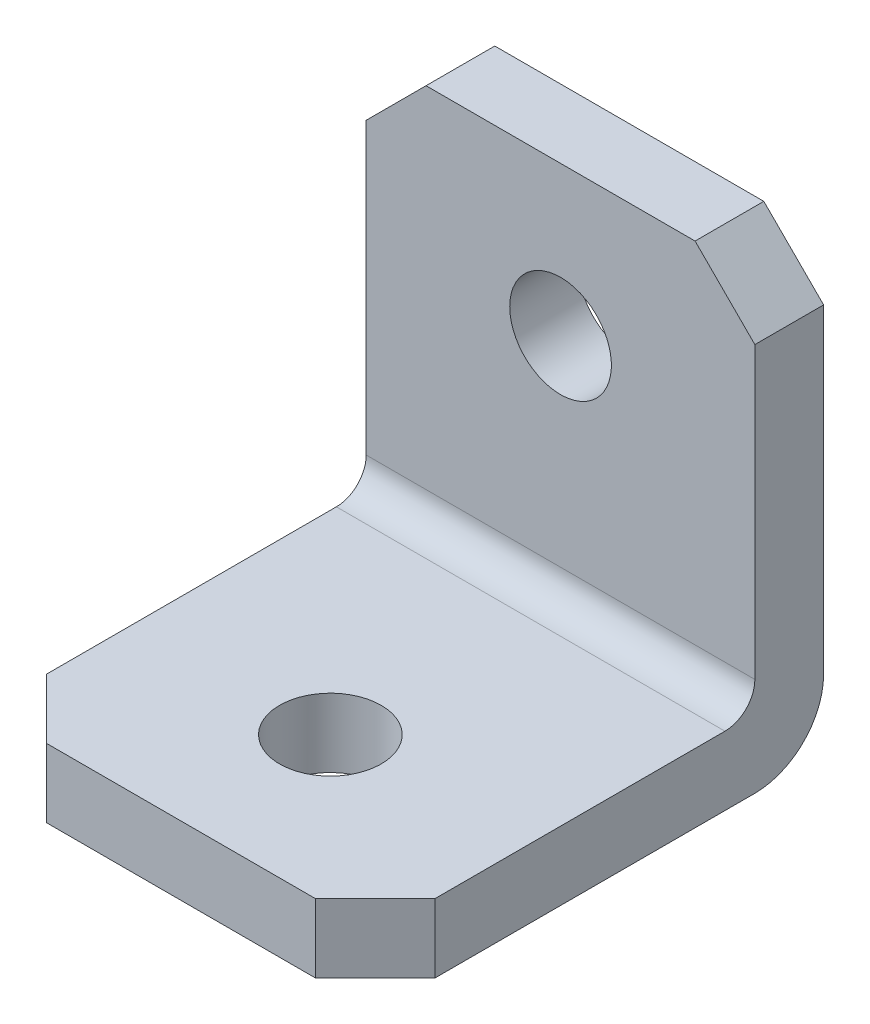
ISO-10303-21;
HEADER;
FILE_DESCRIPTION(('STEP AP214'),'2;1');
FILE_NAME('part.step','',(''),(''),'','','');
FILE_SCHEMA(('AUTOMOTIVE_DESIGN { 1 0 10303 214 1 1 1 1 }'));
ENDSEC;
DATA;
#1=APPLICATION_CONTEXT('core data for automotive mechanical design processes');
#2=APPLICATION_PROTOCOL_DEFINITION('international standard','automotive_design',2000,#1);
#3=PRODUCT_CONTEXT('',#1,'mechanical');
#4=PRODUCT('Part','Part','',(#3));
#5=PRODUCT_RELATED_PRODUCT_CATEGORY('part','',(#4));
#6=PRODUCT_DEFINITION_FORMATION('','',#4);
#7=PRODUCT_DEFINITION_CONTEXT('part definition',#1,'design');
#8=PRODUCT_DEFINITION('design','',#6,#7);
#9=PRODUCT_DEFINITION_SHAPE('','',#8);
#10=(LENGTH_UNIT() NAMED_UNIT(*) SI_UNIT(.MILLI.,.METRE.));
#11=(NAMED_UNIT(*) PLANE_ANGLE_UNIT() SI_UNIT($,.RADIAN.));
#12=(NAMED_UNIT(*) SI_UNIT($,.STERADIAN.) SOLID_ANGLE_UNIT());
#13=UNCERTAINTY_MEASURE_WITH_UNIT(LENGTH_MEASURE(1.E-05),#10,'distance_accuracy_value','');
#14=(GEOMETRIC_REPRESENTATION_CONTEXT(3) GLOBAL_UNCERTAINTY_ASSIGNED_CONTEXT((#13)) GLOBAL_UNIT_ASSIGNED_CONTEXT((#10,
#11,#12)) REPRESENTATION_CONTEXT('',''));
#15=CARTESIAN_POINT('',(0.,0.,0.));
#16=DIRECTION('',(0.,0.,1.));
#17=DIRECTION('',(1.,0.,0.));
#18=AXIS2_PLACEMENT_3D('',#15,#16,#17);
#19=CARTESIAN_POINT('',(6.5,2.3,3.3));
#20=DIRECTION('',(0.,-1.,0.));
#21=DIRECTION('',(0.,0.,-1.));
#22=AXIS2_PLACEMENT_3D('',#19,#20,#21);
#23=PLANE('',#22);
#24=CARTESIAN_POINT('',(0.,2.3,10.));
#25=DIRECTION('',(0.,1.,0.));
#26=DIRECTION('',(0.,0.,-1.));
#27=AXIS2_PLACEMENT_3D('',#24,#25,#26);
#28=CIRCLE('',#27,1.7);
#29=CARTESIAN_POINT('',(0.,2.3,8.3));
#30=VERTEX_POINT('',#29);
#31=EDGE_CURVE('E127',#30,#30,#28,.T.);
#32=ORIENTED_EDGE('',*,*,#31,.F.);
#33=EDGE_LOOP('',(#32));
#34=FACE_BOUND('',#33,.T.);
#35=DIRECTION('',(-1.,0.,0.));
#36=VECTOR('',#35,1.);
#37=CARTESIAN_POINT('',(4.5,2.3,15.));
#38=LINE('',#37,#36);
#39=CARTESIAN_POINT('',(4.5,2.3,15.));
#40=VERTEX_POINT('',#39);
#41=CARTESIAN_POINT('',(-4.5,2.3,15.));
#42=VERTEX_POINT('',#41);
#43=EDGE_CURVE('E114',#40,#42,#38,.T.);
#44=ORIENTED_EDGE('',*,*,#43,.F.);
#45=DIRECTION('',(0.707106781186548,0.,-0.707106781186547));
#46=VECTOR('',#45,1.);
#47=CARTESIAN_POINT('',(4.49999999999999,2.3,15.));
#48=LINE('',#47,#46);
#49=CARTESIAN_POINT('',(6.5,2.3,13.));
#50=VERTEX_POINT('',#49);
#51=EDGE_CURVE('E103',#40,#50,#48,.T.);
#52=ORIENTED_EDGE('',*,*,#51,.T.);
#53=DIRECTION('',(0.,0.,1.));
#54=VECTOR('',#53,1.);
#55=CARTESIAN_POINT('',(6.5,2.3,3.3));
#56=LINE('',#55,#54);
#57=CARTESIAN_POINT('',(6.5,2.3,3.3));
#58=VERTEX_POINT('',#57);
#59=EDGE_CURVE('E113',#58,#50,#56,.T.);
#60=ORIENTED_EDGE('',*,*,#59,.F.);
#61=DIRECTION('',(-1.,0.,0.));
#62=VECTOR('',#61,1.);
#63=CARTESIAN_POINT('',(6.5,2.3,3.3));
#64=LINE('',#63,#62);
#65=CARTESIAN_POINT('',(-6.5,2.3,3.3));
#66=VERTEX_POINT('',#65);
#67=EDGE_CURVE('E137',#58,#66,#64,.T.);
#68=ORIENTED_EDGE('',*,*,#67,.T.);
#69=DIRECTION('',(0.,0.,1.));
#70=VECTOR('',#69,1.);
#71=CARTESIAN_POINT('',(-6.5,2.3,3.3));
#72=LINE('',#71,#70);
#73=CARTESIAN_POINT('',(-6.5,2.3,13.));
#74=VERTEX_POINT('',#73);
#75=EDGE_CURVE('E142',#66,#74,#72,.T.);
#76=ORIENTED_EDGE('',*,*,#75,.T.);
#77=DIRECTION('',(0.707106781186548,0.,0.707106781186547));
#78=VECTOR('',#77,1.);
#79=CARTESIAN_POINT('',(-6.5,2.3,13.));
#80=LINE('',#79,#78);
#81=EDGE_CURVE('E126',#74,#42,#80,.T.);
#82=ORIENTED_EDGE('',*,*,#81,.T.);
#83=EDGE_LOOP('',(#44,#52,#60,#68,#76,#82));
#84=FACE_BOUND('',#83,.T.);
#85=ADVANCED_FACE('F16',(#34,#84),#23,.F.);
#86=CARTESIAN_POINT('',(0.,3.,10.));
#87=DIRECTION('',(0.,-1.,0.));
#88=DIRECTION('',(0.,0.,-1.));
#89=AXIS2_PLACEMENT_3D('',#86,#87,#88);
#90=CYLINDRICAL_SURFACE('',#89,1.7);
#91=CARTESIAN_POINT('',(0.,0.,10.));
#92=DIRECTION('',(0.,1.,0.));
#93=DIRECTION('',(1.,0.,0.));
#94=AXIS2_PLACEMENT_3D('',#91,#92,#93);
#95=CIRCLE('',#94,1.7);
#96=CARTESIAN_POINT('',(1.7,0.,10.));
#97=VERTEX_POINT('',#96);
#98=EDGE_CURVE('E149',#97,#97,#95,.T.);
#99=ORIENTED_EDGE('',*,*,#98,.F.);
#100=EDGE_LOOP('',(#99));
#101=FACE_BOUND('',#100,.T.);
#102=ORIENTED_EDGE('',*,*,#31,.T.);
#103=EDGE_LOOP('',(#102));
#104=FACE_BOUND('',#103,.T.);
#105=ADVANCED_FACE('F323',(#101,#104),#90,.F.);
#106=CARTESIAN_POINT('',(6.5,2.3,15.));
#107=DIRECTION('',(0.,0.,-1.));
#108=DIRECTION('',(-1.,0.,0.));
#109=AXIS2_PLACEMENT_3D('',#106,#107,#108);
#110=PLANE('',#109);
#111=DIRECTION('',(-1.,0.,0.));
#112=VECTOR('',#111,1.);
#113=CARTESIAN_POINT('',(4.5,0.,15.));
#114=LINE('',#113,#112);
#115=CARTESIAN_POINT('',(4.5,0.,15.));
#116=VERTEX_POINT('',#115);
#117=CARTESIAN_POINT('',(-4.5,0.,15.));
#118=VERTEX_POINT('',#117);
#119=EDGE_CURVE('E121',#116,#118,#114,.T.);
#120=ORIENTED_EDGE('',*,*,#119,.F.);
#121=DIRECTION('',(0.,-1.,0.));
#122=VECTOR('',#121,1.);
#123=CARTESIAN_POINT('',(4.5,2.3,15.));
#124=LINE('',#123,#122);
#125=EDGE_CURVE('E107',#40,#116,#124,.T.);
#126=ORIENTED_EDGE('',*,*,#125,.F.);
#127=ORIENTED_EDGE('',*,*,#43,.T.);
#128=DIRECTION('',(0.,-1.,0.));
#129=VECTOR('',#128,1.);
#130=CARTESIAN_POINT('',(-4.5,2.3,15.));
#131=LINE('',#130,#129);
#132=EDGE_CURVE('E122',#42,#118,#131,.T.);
#133=ORIENTED_EDGE('',*,*,#132,.T.);
#134=EDGE_LOOP('',(#120,#126,#127,#133));
#135=FACE_BOUND('',#134,.T.);
#136=ADVANCED_FACE('F119',(#135),#110,.F.);
#137=CARTESIAN_POINT('',(4.5,3.,15.));
#138=DIRECTION('',(-0.707106781186547,0.,-0.707106781186548));
#139=DIRECTION('',(-0.707106781186548,0.,0.707106781186547));
#140=AXIS2_PLACEMENT_3D('',#137,#138,#139);
#141=PLANE('',#140);
#142=ORIENTED_EDGE('',*,*,#125,.T.);
#143=DIRECTION('',(0.707106781186548,0.,-0.707106781186547));
#144=VECTOR('',#143,1.);
#145=CARTESIAN_POINT('',(4.5,0.,15.));
#146=LINE('',#145,#144);
#147=CARTESIAN_POINT('',(6.5,0.,13.));
#148=VERTEX_POINT('',#147);
#149=EDGE_CURVE('E160',#116,#148,#146,.T.);
#150=ORIENTED_EDGE('',*,*,#149,.T.);
#151=DIRECTION('',(0.,1.,0.));
#152=VECTOR('',#151,1.);
#153=CARTESIAN_POINT('',(6.5,0.,13.));
#154=LINE('',#153,#152);
#155=EDGE_CURVE('E109',#148,#50,#154,.T.);
#156=ORIENTED_EDGE('',*,*,#155,.T.);
#157=ORIENTED_EDGE('',*,*,#51,.F.);
#158=EDGE_LOOP('',(#142,#150,#156,#157));
#159=FACE_BOUND('',#158,.T.);
#160=ADVANCED_FACE('F105',(#159),#141,.F.);
#161=CARTESIAN_POINT('',(6.5,2.3,2.3));
#162=DIRECTION('',(1.,0.,0.));
#163=DIRECTION('',(0.,0.,-1.));
#164=AXIS2_PLACEMENT_3D('',#161,#162,#163);
#165=PLANE('',#164);
#166=DIRECTION('',(0.,-1.,0.));
#167=VECTOR('',#166,1.);
#168=CARTESIAN_POINT('',(6.5,13.,2.3));
#169=LINE('',#168,#167);
#170=CARTESIAN_POINT('',(6.5,13.,2.3));
#171=VERTEX_POINT('',#170);
#172=CARTESIAN_POINT('',(6.5,3.3,2.3));
#173=VERTEX_POINT('',#172);
#174=EDGE_CURVE('E167',#171,#173,#169,.T.);
#175=ORIENTED_EDGE('',*,*,#174,.T.);
#176=CARTESIAN_POINT('',(6.5,3.30000000000017,3.30000000000017));
#177=DIRECTION('',(1.,0.,0.));
#178=DIRECTION('',(0.,-1.,-1.65201186064197E-13));
#179=AXIS2_PLACEMENT_3D('',#176,#177,#178);
#180=CIRCLE('',#179,1.00000000000016);
#181=EDGE_CURVE('E172',#58,#173,#180,.T.);
#182=ORIENTED_EDGE('',*,*,#181,.F.);
#183=ORIENTED_EDGE('',*,*,#59,.T.);
#184=ORIENTED_EDGE('',*,*,#155,.F.);
#185=DIRECTION('',(0.,0.,-1.));
#186=VECTOR('',#185,1.);
#187=CARTESIAN_POINT('',(6.5,0.,13.));
#188=LINE('',#187,#186);
#189=CARTESIAN_POINT('',(6.5,0.,2.3));
#190=VERTEX_POINT('',#189);
#191=EDGE_CURVE('E177',#148,#190,#188,.T.);
#192=ORIENTED_EDGE('',*,*,#191,.T.);
#193=CARTESIAN_POINT('',(6.5,2.3,2.3));
#194=DIRECTION('',(1.,0.,0.));
#195=DIRECTION('',(0.,-1.,0.));
#196=AXIS2_PLACEMENT_3D('',#193,#194,#195);
#197=CIRCLE('',#196,2.3);
#198=CARTESIAN_POINT('',(6.5,2.3,0.));
#199=VERTEX_POINT('',#198);
#200=EDGE_CURVE('E182',#190,#199,#197,.T.);
#201=ORIENTED_EDGE('',*,*,#200,.T.);
#202=DIRECTION('',(0.,1.,0.));
#203=VECTOR('',#202,1.);
#204=CARTESIAN_POINT('',(6.5,2.3,0.));
#205=LINE('',#204,#203);
#206=CARTESIAN_POINT('',(6.5,13.,0.));
#207=VERTEX_POINT('',#206);
#208=EDGE_CURVE('E187',#199,#207,#205,.T.);
#209=ORIENTED_EDGE('',*,*,#208,.T.);
#210=DIRECTION('',(0.,0.,-1.));
#211=VECTOR('',#210,1.);
#212=CARTESIAN_POINT('',(6.5,13.,2.3));
#213=LINE('',#212,#211);
#214=EDGE_CURVE('E192',#171,#207,#213,.T.);
#215=ORIENTED_EDGE('',*,*,#214,.F.);
#216=EDGE_LOOP('',(#175,#182,#183,#184,#192,#201,#209,#215));
#217=FACE_BOUND('',#216,.T.);
#218=ADVANCED_FACE('F302',(#217),#165,.T.);
#219=CARTESIAN_POINT('',(6.5,3.30000000000017,3.30000000000017));
#220=DIRECTION('',(-1.,0.,0.));
#221=DIRECTION('',(0.,0.,1.));
#222=AXIS2_PLACEMENT_3D('',#219,#220,#221);
#223=CYLINDRICAL_SURFACE('',#222,1.00000000000016);
#224=CARTESIAN_POINT('',(-6.5,3.30000000000017,3.30000000000017));
#225=DIRECTION('',(1.,0.,0.));
#226=DIRECTION('',(0.,-1.,-1.65201186064197E-13));
#227=AXIS2_PLACEMENT_3D('',#224,#225,#226);
#228=CIRCLE('',#227,1.00000000000016);
#229=CARTESIAN_POINT('',(-6.5,3.3,2.3));
#230=VERTEX_POINT('',#229);
#231=EDGE_CURVE('E196',#66,#230,#228,.T.);
#232=ORIENTED_EDGE('',*,*,#231,.F.);
#233=ORIENTED_EDGE('',*,*,#67,.F.);
#234=ORIENTED_EDGE('',*,*,#181,.T.);
#235=DIRECTION('',(-1.,0.,0.));
#236=VECTOR('',#235,1.);
#237=CARTESIAN_POINT('',(6.5,3.3,2.3));
#238=LINE('',#237,#236);
#239=EDGE_CURVE('E201',#173,#230,#238,.T.);
#240=ORIENTED_EDGE('',*,*,#239,.T.);
#241=EDGE_LOOP('',(#232,#233,#234,#240));
#242=FACE_BOUND('',#241,.T.);
#243=ADVANCED_FACE('F320',(#242),#223,.F.);
#244=CARTESIAN_POINT('',(-6.5,2.3,2.3));
#245=DIRECTION('',(1.,0.,0.));
#246=DIRECTION('',(0.,0.,-1.));
#247=AXIS2_PLACEMENT_3D('',#244,#245,#246);
#248=PLANE('',#247);
#249=DIRECTION('',(0.,0.,-1.));
#250=VECTOR('',#249,1.);
#251=CARTESIAN_POINT('',(-6.5,13.,2.3));
#252=LINE('',#251,#250);
#253=CARTESIAN_POINT('',(-6.5,13.,2.3));
#254=VERTEX_POINT('',#253);
#255=CARTESIAN_POINT('',(-6.5,13.,0.));
#256=VERTEX_POINT('',#255);
#257=EDGE_CURVE('E206',#254,#256,#252,.T.);
#258=ORIENTED_EDGE('',*,*,#257,.T.);
#259=DIRECTION('',(0.,1.,0.));
#260=VECTOR('',#259,1.);
#261=CARTESIAN_POINT('',(-6.5,2.3,0.));
#262=LINE('',#261,#260);
#263=CARTESIAN_POINT('',(-6.5,2.3,0.));
#264=VERTEX_POINT('',#263);
#265=EDGE_CURVE('E211',#264,#256,#262,.T.);
#266=ORIENTED_EDGE('',*,*,#265,.F.);
#267=CARTESIAN_POINT('',(-6.5,2.3,2.3));
#268=DIRECTION('',(1.,0.,0.));
#269=DIRECTION('',(0.,-1.,0.));
#270=AXIS2_PLACEMENT_3D('',#267,#268,#269);
#271=CIRCLE('',#270,2.3);
#272=CARTESIAN_POINT('',(-6.5,0.,2.3));
#273=VERTEX_POINT('',#272);
#274=EDGE_CURVE('E216',#273,#264,#271,.T.);
#275=ORIENTED_EDGE('',*,*,#274,.F.);
#276=DIRECTION('',(0.,0.,-1.));
#277=VECTOR('',#276,1.);
#278=CARTESIAN_POINT('',(-6.5,0.,13.));
#279=LINE('',#278,#277);
#280=CARTESIAN_POINT('',(-6.5,0.,13.));
#281=VERTEX_POINT('',#280);
#282=EDGE_CURVE('E221',#281,#273,#279,.T.);
#283=ORIENTED_EDGE('',*,*,#282,.F.);
#284=DIRECTION('',(0.,1.,0.));
#285=VECTOR('',#284,1.);
#286=CARTESIAN_POINT('',(-6.5,0.,13.));
#287=LINE('',#286,#285);
#288=EDGE_CURVE('E226',#281,#74,#287,.T.);
#289=ORIENTED_EDGE('',*,*,#288,.T.);
#290=ORIENTED_EDGE('',*,*,#75,.F.);
#291=ORIENTED_EDGE('',*,*,#231,.T.);
#292=DIRECTION('',(0.,-1.,0.));
#293=VECTOR('',#292,1.);
#294=CARTESIAN_POINT('',(-6.5,13.,2.3));
#295=LINE('',#294,#293);
#296=EDGE_CURVE('E231',#254,#230,#295,.T.);
#297=ORIENTED_EDGE('',*,*,#296,.F.);
#298=EDGE_LOOP('',(#258,#266,#275,#283,#289,#290,#291,#297));
#299=FACE_BOUND('',#298,.T.);
#300=ADVANCED_FACE('F293',(#299),#248,.F.);
#301=CARTESIAN_POINT('',(-6.5,3.,13.));
#302=DIRECTION('',(0.707106781186547,0.,-0.707106781186548));
#303=DIRECTION('',(-0.707106781186548,0.,-0.707106781186547));
#304=AXIS2_PLACEMENT_3D('',#301,#302,#303);
#305=PLANE('',#304);
#306=ORIENTED_EDGE('',*,*,#288,.F.);
#307=DIRECTION('',(0.707106781186548,0.,0.707106781186547));
#308=VECTOR('',#307,1.);
#309=CARTESIAN_POINT('',(-6.5,0.,13.));
#310=LINE('',#309,#308);
#311=EDGE_CURVE('E235',#281,#118,#310,.T.);
#312=ORIENTED_EDGE('',*,*,#311,.T.);
#313=ORIENTED_EDGE('',*,*,#132,.F.);
#314=ORIENTED_EDGE('',*,*,#81,.F.);
#315=EDGE_LOOP('',(#306,#312,#313,#314));
#316=FACE_BOUND('',#315,.T.);
#317=ADVANCED_FACE('F309',(#316),#305,.F.);
#318=CARTESIAN_POINT('',(6.5,0.,15.));
#319=DIRECTION('',(0.,1.,0.));
#320=DIRECTION('',(0.,0.,1.));
#321=AXIS2_PLACEMENT_3D('',#318,#319,#320);
#322=PLANE('',#321);
#323=ORIENTED_EDGE('',*,*,#98,.T.);
#324=EDGE_LOOP('',(#323));
#325=FACE_BOUND('',#324,.T.);
#326=ORIENTED_EDGE('',*,*,#191,.F.);
#327=ORIENTED_EDGE('',*,*,#149,.F.);
#328=ORIENTED_EDGE('',*,*,#119,.T.);
#329=ORIENTED_EDGE('',*,*,#311,.F.);
#330=ORIENTED_EDGE('',*,*,#282,.T.);
#331=DIRECTION('',(-1.,0.,0.));
#332=VECTOR('',#331,1.);
#333=CARTESIAN_POINT('',(6.5,0.,2.3));
#334=LINE('',#333,#332);
#335=EDGE_CURVE('E240',#190,#273,#334,.T.);
#336=ORIENTED_EDGE('',*,*,#335,.F.);
#337=EDGE_LOOP('',(#326,#327,#328,#329,#330,#336));
#338=FACE_BOUND('',#337,.T.);
#339=ADVANCED_FACE('F305',(#325,#338),#322,.F.);
#340=CARTESIAN_POINT('',(6.5,15.,2.3));
#341=DIRECTION('',(0.,0.,-1.));
#342=DIRECTION('',(-1.,0.,0.));
#343=AXIS2_PLACEMENT_3D('',#340,#341,#342);
#344=PLANE('',#343);
#345=CARTESIAN_POINT('',(0.,10.,2.3));
#346=DIRECTION('',(0.,0.,1.));
#347=DIRECTION('',(-1.,0.,0.));
#348=AXIS2_PLACEMENT_3D('',#345,#346,#347);
#349=CIRCLE('',#348,1.7);
#350=CARTESIAN_POINT('',(-1.7,10.,2.3));
#351=VERTEX_POINT('',#350);
#352=EDGE_CURVE('E244',#351,#351,#349,.T.);
#353=ORIENTED_EDGE('',*,*,#352,.F.);
#354=EDGE_LOOP('',(#353));
#355=FACE_BOUND('',#354,.T.);
#356=DIRECTION('',(-1.,0.,0.));
#357=VECTOR('',#356,1.);
#358=CARTESIAN_POINT('',(4.5,15.,2.3));
#359=LINE('',#358,#357);
#360=CARTESIAN_POINT('',(4.5,15.,2.3));
#361=VERTEX_POINT('',#360);
#362=CARTESIAN_POINT('',(-4.5,15.,2.3));
#363=VERTEX_POINT('',#362);
#364=EDGE_CURVE('E249',#361,#363,#359,.T.);
#365=ORIENTED_EDGE('',*,*,#364,.T.);
#366=DIRECTION('',(-0.707106781186548,-0.707106781186547,0.));
#367=VECTOR('',#366,1.);
#368=CARTESIAN_POINT('',(-4.5,15.,2.3));
#369=LINE('',#368,#367);
#370=EDGE_CURVE('E252',#363,#254,#369,.T.);
#371=ORIENTED_EDGE('',*,*,#370,.T.);
#372=ORIENTED_EDGE('',*,*,#296,.T.);
#373=ORIENTED_EDGE('',*,*,#239,.F.);
#374=ORIENTED_EDGE('',*,*,#174,.F.);
#375=DIRECTION('',(-0.707106781186548,0.707106781186547,0.));
#376=VECTOR('',#375,1.);
#377=CARTESIAN_POINT('',(6.5,13.,2.3));
#378=LINE('',#377,#376);
#379=EDGE_CURVE('E257',#171,#361,#378,.T.);
#380=ORIENTED_EDGE('',*,*,#379,.T.);
#381=EDGE_LOOP('',(#365,#371,#372,#373,#374,#380));
#382=FACE_BOUND('',#381,.T.);
#383=ADVANCED_FACE('F317',(#355,#382),#344,.F.);
#384=CARTESIAN_POINT('',(6.5,2.3,2.3));
#385=DIRECTION('',(-1.,0.,0.));
#386=DIRECTION('',(0.,0.,1.));
#387=AXIS2_PLACEMENT_3D('',#384,#385,#386);
#388=CYLINDRICAL_SURFACE('',#387,2.3);
#389=ORIENTED_EDGE('',*,*,#274,.T.);
#390=DIRECTION('',(-1.,0.,0.));
#391=VECTOR('',#390,1.);
#392=CARTESIAN_POINT('',(6.5,2.3,0.));
#393=LINE('',#392,#391);
#394=EDGE_CURVE('E262',#199,#264,#393,.T.);
#395=ORIENTED_EDGE('',*,*,#394,.F.);
#396=ORIENTED_EDGE('',*,*,#200,.F.);
#397=ORIENTED_EDGE('',*,*,#335,.T.);
#398=EDGE_LOOP('',(#389,#395,#396,#397));
#399=FACE_BOUND('',#398,.T.);
#400=ADVANCED_FACE('F299',(#399),#388,.T.);
#401=CARTESIAN_POINT('',(6.5,2.3,0.));
#402=DIRECTION('',(0.,0.,1.));
#403=DIRECTION('',(1.,0.,0.));
#404=AXIS2_PLACEMENT_3D('',#401,#402,#403);
#405=PLANE('',#404);
#406=CARTESIAN_POINT('',(0.,10.,0.));
#407=DIRECTION('',(0.,0.,1.));
#408=DIRECTION('',(1.,0.,0.));
#409=AXIS2_PLACEMENT_3D('',#406,#407,#408);
#410=CIRCLE('',#409,1.7);
#411=CARTESIAN_POINT('',(1.7,10.,0.));
#412=VERTEX_POINT('',#411);
#413=EDGE_CURVE('E266',#412,#412,#410,.T.);
#414=ORIENTED_EDGE('',*,*,#413,.T.);
#415=EDGE_LOOP('',(#414));
#416=FACE_BOUND('',#415,.T.);
#417=DIRECTION('',(-0.707106781186548,0.707106781186547,0.));
#418=VECTOR('',#417,1.);
#419=CARTESIAN_POINT('',(6.5,13.,0.));
#420=LINE('',#419,#418);
#421=CARTESIAN_POINT('',(4.5,15.,0.));
#422=VERTEX_POINT('',#421);
#423=EDGE_CURVE('E271',#207,#422,#420,.T.);
#424=ORIENTED_EDGE('',*,*,#423,.F.);
#425=ORIENTED_EDGE('',*,*,#208,.F.);
#426=ORIENTED_EDGE('',*,*,#394,.T.);
#427=ORIENTED_EDGE('',*,*,#265,.T.);
#428=DIRECTION('',(-0.707106781186548,-0.707106781186547,0.));
#429=VECTOR('',#428,1.);
#430=CARTESIAN_POINT('',(-4.5,15.,0.));
#431=LINE('',#430,#429);
#432=CARTESIAN_POINT('',(-4.5,15.,0.));
#433=VERTEX_POINT('',#432);
#434=EDGE_CURVE('E274',#433,#256,#431,.T.);
#435=ORIENTED_EDGE('',*,*,#434,.F.);
#436=DIRECTION('',(-1.,0.,0.));
#437=VECTOR('',#436,1.);
#438=CARTESIAN_POINT('',(4.5,15.,0.));
#439=LINE('',#438,#437);
#440=EDGE_CURVE('E35',#422,#433,#439,.T.);
#441=ORIENTED_EDGE('',*,*,#440,.F.);
#442=EDGE_LOOP('',(#424,#425,#426,#427,#435,#441));
#443=FACE_BOUND('',#442,.T.);
#444=ADVANCED_FACE('F296',(#416,#443),#405,.F.);
#445=CARTESIAN_POINT('',(6.5,13.,3.));
#446=DIRECTION('',(-0.707106781186547,-0.707106781186548,0.));
#447=DIRECTION('',(0.707106781186548,-0.707106781186547,0.));
#448=AXIS2_PLACEMENT_3D('',#445,#446,#447);
#449=PLANE('',#448);
#450=ORIENTED_EDGE('',*,*,#214,.T.);
#451=ORIENTED_EDGE('',*,*,#423,.T.);
#452=DIRECTION('',(0.,0.,-1.));
#453=VECTOR('',#452,1.);
#454=CARTESIAN_POINT('',(4.5,15.,2.3));
#455=LINE('',#454,#453);
#456=EDGE_CURVE('E25',#361,#422,#455,.T.);
#457=ORIENTED_EDGE('',*,*,#456,.F.);
#458=ORIENTED_EDGE('',*,*,#379,.F.);
#459=EDGE_LOOP('',(#450,#451,#457,#458));
#460=FACE_BOUND('',#459,.T.);
#461=ADVANCED_FACE('F348',(#460),#449,.F.);
#462=CARTESIAN_POINT('',(-4.5,15.,3.));
#463=DIRECTION('',(0.707106781186547,-0.707106781186548,0.));
#464=DIRECTION('',(0.707106781186548,0.707106781186547,0.));
#465=AXIS2_PLACEMENT_3D('',#462,#463,#464);
#466=PLANE('',#465);
#467=DIRECTION('',(0.,0.,-1.));
#468=VECTOR('',#467,1.);
#469=CARTESIAN_POINT('',(-4.5,15.,2.3));
#470=LINE('',#469,#468);
#471=EDGE_CURVE('E10',#363,#433,#470,.T.);
#472=ORIENTED_EDGE('',*,*,#471,.T.);
#473=ORIENTED_EDGE('',*,*,#434,.T.);
#474=ORIENTED_EDGE('',*,*,#257,.F.);
#475=ORIENTED_EDGE('',*,*,#370,.F.);
#476=EDGE_LOOP('',(#472,#473,#474,#475));
#477=FACE_BOUND('',#476,.T.);
#478=ADVANCED_FACE('F287',(#477),#466,.F.);
#479=CARTESIAN_POINT('',(0.,10.,3.));
#480=DIRECTION('',(0.,0.,-1.));
#481=DIRECTION('',(-1.,0.,0.));
#482=AXIS2_PLACEMENT_3D('',#479,#480,#481);
#483=CYLINDRICAL_SURFACE('',#482,1.7);
#484=ORIENTED_EDGE('',*,*,#413,.F.);
#485=EDGE_LOOP('',(#484));
#486=FACE_BOUND('',#485,.T.);
#487=ORIENTED_EDGE('',*,*,#352,.T.);
#488=EDGE_LOOP('',(#487));
#489=FACE_BOUND('',#488,.T.);
#490=ADVANCED_FACE('F355',(#486,#489),#483,.F.);
#491=CARTESIAN_POINT('',(6.5,15.,0.));
#492=DIRECTION('',(0.,-1.,0.));
#493=DIRECTION('',(0.,0.,-1.));
#494=AXIS2_PLACEMENT_3D('',#491,#492,#493);
#495=PLANE('',#494);
#496=ORIENTED_EDGE('',*,*,#440,.T.);
#497=ORIENTED_EDGE('',*,*,#471,.F.);
#498=ORIENTED_EDGE('',*,*,#364,.F.);
#499=ORIENTED_EDGE('',*,*,#456,.T.);
#500=EDGE_LOOP('',(#496,#497,#498,#499));
#501=FACE_BOUND('',#500,.T.);
#502=ADVANCED_FACE('F18',(#501),#495,.F.);
#503=CLOSED_SHELL('',(#85,#105,#136,#160,#218,#243,#300,#317,#339,#383,#400,#444,#461,#478,#490,#502));
#504=MANIFOLD_SOLID_BREP('B1',#503);
#505=ADVANCED_BREP_SHAPE_REPRESENTATION('',(#18,#504),#14);
#506=SHAPE_DEFINITION_REPRESENTATION(#9,#505);
ENDSEC;
END-ISO-10303-21;
